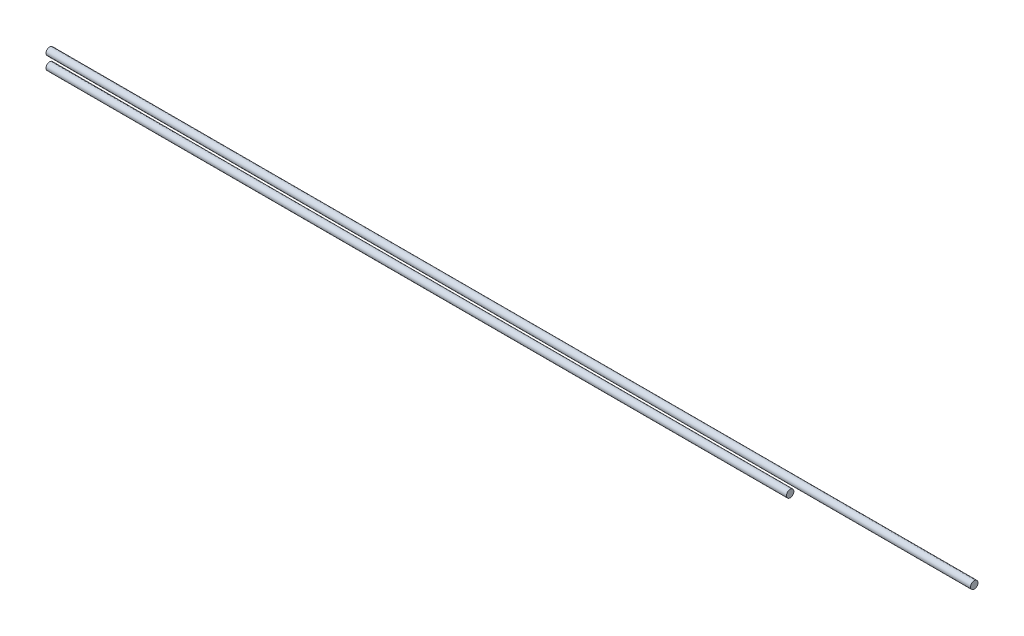
ISO-10303-21;
HEADER;
FILE_DESCRIPTION(('STEP AP214'),'2;1');
FILE_NAME('part.step','',(''),(''),'','','');
FILE_SCHEMA(('AUTOMOTIVE_DESIGN { 1 0 10303 214 1 1 1 1 }'));
ENDSEC;
DATA;
#1=APPLICATION_CONTEXT('core data for automotive mechanical design processes');
#2=APPLICATION_PROTOCOL_DEFINITION('international standard','automotive_design',2000,#1);
#3=PRODUCT_CONTEXT('',#1,'mechanical');
#4=PRODUCT('Part','Part','',(#3));
#5=PRODUCT_RELATED_PRODUCT_CATEGORY('part','',(#4));
#6=PRODUCT_DEFINITION_FORMATION('','',#4);
#7=PRODUCT_DEFINITION_CONTEXT('part definition',#1,'design');
#8=PRODUCT_DEFINITION('design','',#6,#7);
#9=PRODUCT_DEFINITION_SHAPE('','',#8);
#10=(LENGTH_UNIT() NAMED_UNIT(*) SI_UNIT(.MILLI.,.METRE.));
#11=(NAMED_UNIT(*) PLANE_ANGLE_UNIT() SI_UNIT($,.RADIAN.));
#12=(NAMED_UNIT(*) SI_UNIT($,.STERADIAN.) SOLID_ANGLE_UNIT());
#13=UNCERTAINTY_MEASURE_WITH_UNIT(LENGTH_MEASURE(1.E-05),#10,'distance_accuracy_value','');
#14=(GEOMETRIC_REPRESENTATION_CONTEXT(3) GLOBAL_UNCERTAINTY_ASSIGNED_CONTEXT((#13)) GLOBAL_UNIT_ASSIGNED_CONTEXT((#10,
#11,#12)) REPRESENTATION_CONTEXT('',''));
#15=CARTESIAN_POINT('',(0.,0.,0.));
#16=DIRECTION('',(0.,0.,1.));
#17=DIRECTION('',(1.,0.,0.));
#18=AXIS2_PLACEMENT_3D('',#15,#16,#17);
#19=CARTESIAN_POINT('',(0.,-3.56,0.));
#20=DIRECTION('',(1.,0.,0.));
#21=DIRECTION('',(0.,0.,-1.));
#22=AXIS2_PLACEMENT_3D('',#19,#20,#21);
#23=PLANE('',#22);
#24=CARTESIAN_POINT('',(0.,-3.56,0.));
#25=DIRECTION('',(1.,0.,0.));
#26=DIRECTION('',(0.,0.,-1.));
#27=AXIS2_PLACEMENT_3D('',#24,#25,#26);
#28=CIRCLE('',#27,0.345);
#29=CARTESIAN_POINT('',(0.,-3.56,-0.345));
#30=VERTEX_POINT('',#29);
#31=EDGE_CURVE('P0_E18',#30,#30,#28,.T.);
#32=ORIENTED_EDGE('',*,*,#31,.F.);
#33=EDGE_LOOP('',(#32));
#34=FACE_BOUND('',#33,.T.);
#35=ADVANCED_FACE('P0_F15',(#34),#23,.F.);
#36=CARTESIAN_POINT('',(85.8626704154744,-3.56,0.));
#37=DIRECTION('',(1.,0.,0.));
#38=DIRECTION('',(0.,0.,-1.));
#39=AXIS2_PLACEMENT_3D('',#36,#37,#38);
#40=PLANE('',#39);
#41=CARTESIAN_POINT('',(85.8626704154744,-3.56,0.));
#42=DIRECTION('',(1.,0.,0.));
#43=DIRECTION('',(0.,0.,-1.));
#44=AXIS2_PLACEMENT_3D('',#41,#42,#43);
#45=CIRCLE('',#44,0.345);
#46=CARTESIAN_POINT('',(85.8626704154744,-3.56,-0.345));
#47=VERTEX_POINT('',#46);
#48=EDGE_CURVE('P0_E10',#47,#47,#45,.F.);
#49=ORIENTED_EDGE('',*,*,#48,.F.);
#50=EDGE_LOOP('',(#49));
#51=FACE_BOUND('',#50,.T.);
#52=ADVANCED_FACE('P0_F30',(#51),#40,.T.);
#53=CARTESIAN_POINT('',(0.,-3.56,0.));
#54=DIRECTION('',(1.,0.,0.));
#55=DIRECTION('',(0.,0.,-1.));
#56=AXIS2_PLACEMENT_3D('',#53,#54,#55);
#57=CYLINDRICAL_SURFACE('',#56,0.345);
#58=ORIENTED_EDGE('',*,*,#48,.T.);
#59=EDGE_LOOP('',(#58));
#60=FACE_BOUND('',#59,.T.);
#61=ORIENTED_EDGE('',*,*,#31,.T.);
#62=EDGE_LOOP('',(#61));
#63=FACE_BOUND('',#62,.T.);
#64=ADVANCED_FACE('P0_F27',(#60,#63),#57,.T.);
#65=CLOSED_SHELL('',(#35,#52,#64));
#66=MANIFOLD_SOLID_BREP('P0_B1',#65);
#67=CARTESIAN_POINT('',(0.,-4.75999999999992,0.));
#68=DIRECTION('',(1.,0.,0.));
#69=DIRECTION('',(0.,0.,-1.));
#70=AXIS2_PLACEMENT_3D('',#67,#68,#69);
#71=PLANE('',#70);
#72=CARTESIAN_POINT('',(0.,-4.75999999999992,0.));
#73=DIRECTION('',(1.,0.,0.));
#74=DIRECTION('',(0.,0.,-1.));
#75=AXIS2_PLACEMENT_3D('',#72,#73,#74);
#76=CIRCLE('',#75,0.345);
#77=CARTESIAN_POINT('',(0.,-4.75999999999992,-0.345));
#78=VERTEX_POINT('',#77);
#79=EDGE_CURVE('P1_E18',#78,#78,#76,.T.);
#80=ORIENTED_EDGE('',*,*,#79,.F.);
#81=EDGE_LOOP('',(#80));
#82=FACE_BOUND('',#81,.T.);
#83=ADVANCED_FACE('P1_F15',(#82),#71,.F.);
#84=CARTESIAN_POINT('',(68.7654090166727,-4.75999999999992,0.));
#85=DIRECTION('',(1.,0.,0.));
#86=DIRECTION('',(0.,0.,-1.));
#87=AXIS2_PLACEMENT_3D('',#84,#85,#86);
#88=PLANE('',#87);
#89=CARTESIAN_POINT('',(68.7654090166727,-4.75999999999992,0.));
#90=DIRECTION('',(1.,0.,0.));
#91=DIRECTION('',(0.,0.,-1.));
#92=AXIS2_PLACEMENT_3D('',#89,#90,#91);
#93=CIRCLE('',#92,0.345);
#94=CARTESIAN_POINT('',(68.7654090166727,-4.75999999999992,-0.345));
#95=VERTEX_POINT('',#94);
#96=EDGE_CURVE('P1_E10',#95,#95,#93,.F.);
#97=ORIENTED_EDGE('',*,*,#96,.F.);
#98=EDGE_LOOP('',(#97));
#99=FACE_BOUND('',#98,.T.);
#100=ADVANCED_FACE('P1_F30',(#99),#88,.T.);
#101=CARTESIAN_POINT('',(0.,-4.75999999999992,0.));
#102=DIRECTION('',(1.,0.,0.));
#103=DIRECTION('',(0.,0.,-1.));
#104=AXIS2_PLACEMENT_3D('',#101,#102,#103);
#105=CYLINDRICAL_SURFACE('',#104,0.345);
#106=ORIENTED_EDGE('',*,*,#96,.T.);
#107=EDGE_LOOP('',(#106));
#108=FACE_BOUND('',#107,.T.);
#109=ORIENTED_EDGE('',*,*,#79,.T.);
#110=EDGE_LOOP('',(#109));
#111=FACE_BOUND('',#110,.T.);
#112=ADVANCED_FACE('P1_F27',(#108,#111),#105,.T.);
#113=CLOSED_SHELL('',(#83,#100,#112));
#114=MANIFOLD_SOLID_BREP('P1_B1',#113);
#115=ADVANCED_BREP_SHAPE_REPRESENTATION('',(#18,#66,#114),#14);
#116=SHAPE_DEFINITION_REPRESENTATION(#9,#115);
ENDSEC;
END-ISO-10303-21;
